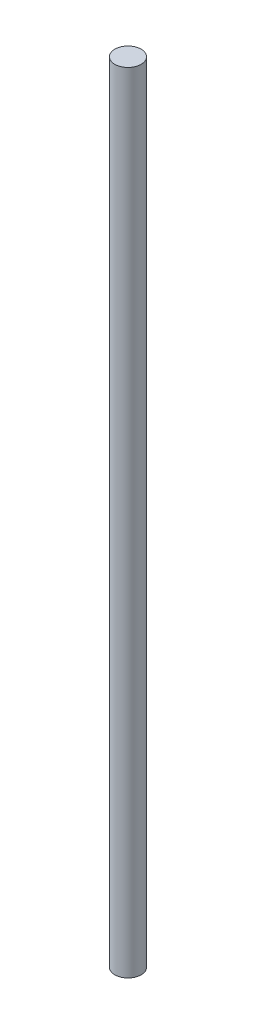
ISO-10303-21;
HEADER;
FILE_DESCRIPTION(('STEP AP214'),'2;1');
FILE_NAME('part.step','',(''),(''),'','','');
FILE_SCHEMA(('AUTOMOTIVE_DESIGN { 1 0 10303 214 1 1 1 1 }'));
ENDSEC;
DATA;
#1=APPLICATION_CONTEXT('core data for automotive mechanical design processes');
#2=APPLICATION_PROTOCOL_DEFINITION('international standard','automotive_design',2000,#1);
#3=PRODUCT_CONTEXT('',#1,'mechanical');
#4=PRODUCT('Part','Part','',(#3));
#5=PRODUCT_RELATED_PRODUCT_CATEGORY('part','',(#4));
#6=PRODUCT_DEFINITION_FORMATION('','',#4);
#7=PRODUCT_DEFINITION_CONTEXT('part definition',#1,'design');
#8=PRODUCT_DEFINITION('design','',#6,#7);
#9=PRODUCT_DEFINITION_SHAPE('','',#8);
#10=(LENGTH_UNIT() NAMED_UNIT(*) SI_UNIT(.MILLI.,.METRE.));
#11=(NAMED_UNIT(*) PLANE_ANGLE_UNIT() SI_UNIT($,.RADIAN.));
#12=(NAMED_UNIT(*) SI_UNIT($,.STERADIAN.) SOLID_ANGLE_UNIT());
#13=UNCERTAINTY_MEASURE_WITH_UNIT(LENGTH_MEASURE(1.E-05),#10,'distance_accuracy_value','');
#14=(GEOMETRIC_REPRESENTATION_CONTEXT(3) GLOBAL_UNCERTAINTY_ASSIGNED_CONTEXT((#13)) GLOBAL_UNIT_ASSIGNED_CONTEXT((#10,
#11,#12)) REPRESENTATION_CONTEXT('',''));
#15=CARTESIAN_POINT('',(0.,0.,0.));
#16=DIRECTION('',(0.,0.,1.));
#17=DIRECTION('',(1.,0.,0.));
#18=AXIS2_PLACEMENT_3D('',#15,#16,#17);
#19=CARTESIAN_POINT('',(0.,-60.,0.));
#20=DIRECTION('',(0.,1.,0.));
#21=DIRECTION('',(0.,0.,1.));
#22=AXIS2_PLACEMENT_3D('',#19,#20,#21);
#23=CYLINDRICAL_SURFACE('',#22,2.);
#24=CARTESIAN_POINT('',(0.,-60.,0.));
#25=DIRECTION('',(0.,1.,0.));
#26=DIRECTION('',(0.,0.,1.));
#27=AXIS2_PLACEMENT_3D('',#24,#25,#26);
#28=CIRCLE('',#27,2.);
#29=CARTESIAN_POINT('',(0.,-60.,2.));
#30=VERTEX_POINT('',#29);
#31=EDGE_CURVE('E10',#30,#30,#28,.T.);
#32=ORIENTED_EDGE('',*,*,#31,.T.);
#33=EDGE_LOOP('',(#32));
#34=FACE_BOUND('',#33,.T.);
#35=CARTESIAN_POINT('',(0.,60.,0.));
#36=DIRECTION('',(0.,1.,0.));
#37=DIRECTION('',(0.,0.,1.));
#38=AXIS2_PLACEMENT_3D('',#35,#36,#37);
#39=CIRCLE('',#38,2.);
#40=CARTESIAN_POINT('',(0.,60.,2.));
#41=VERTEX_POINT('',#40);
#42=EDGE_CURVE('E38',#41,#41,#39,.T.);
#43=ORIENTED_EDGE('',*,*,#42,.F.);
#44=EDGE_LOOP('',(#43));
#45=FACE_BOUND('',#44,.T.);
#46=ADVANCED_FACE('F32',(#34,#45),#23,.T.);
#47=CARTESIAN_POINT('',(0.,-60.,0.));
#48=DIRECTION('',(0.,1.,0.));
#49=DIRECTION('',(0.,0.,1.));
#50=AXIS2_PLACEMENT_3D('',#47,#48,#49);
#51=PLANE('',#50);
#52=ORIENTED_EDGE('',*,*,#31,.F.);
#53=EDGE_LOOP('',(#52));
#54=FACE_BOUND('',#53,.T.);
#55=ADVANCED_FACE('F47',(#54),#51,.F.);
#56=CARTESIAN_POINT('',(0.,60.,0.));
#57=DIRECTION('',(0.,1.,0.));
#58=DIRECTION('',(0.,0.,1.));
#59=AXIS2_PLACEMENT_3D('',#56,#57,#58);
#60=PLANE('',#59);
#61=ORIENTED_EDGE('',*,*,#42,.T.);
#62=EDGE_LOOP('',(#61));
#63=FACE_BOUND('',#62,.T.);
#64=ADVANCED_FACE('F44',(#63),#60,.T.);
#65=CLOSED_SHELL('',(#46,#55,#64));
#66=MANIFOLD_SOLID_BREP('B2',#65);
#67=ADVANCED_BREP_SHAPE_REPRESENTATION('',(#18,#66),#14);
#68=SHAPE_DEFINITION_REPRESENTATION(#9,#67);
ENDSEC;
END-ISO-10303-21;
